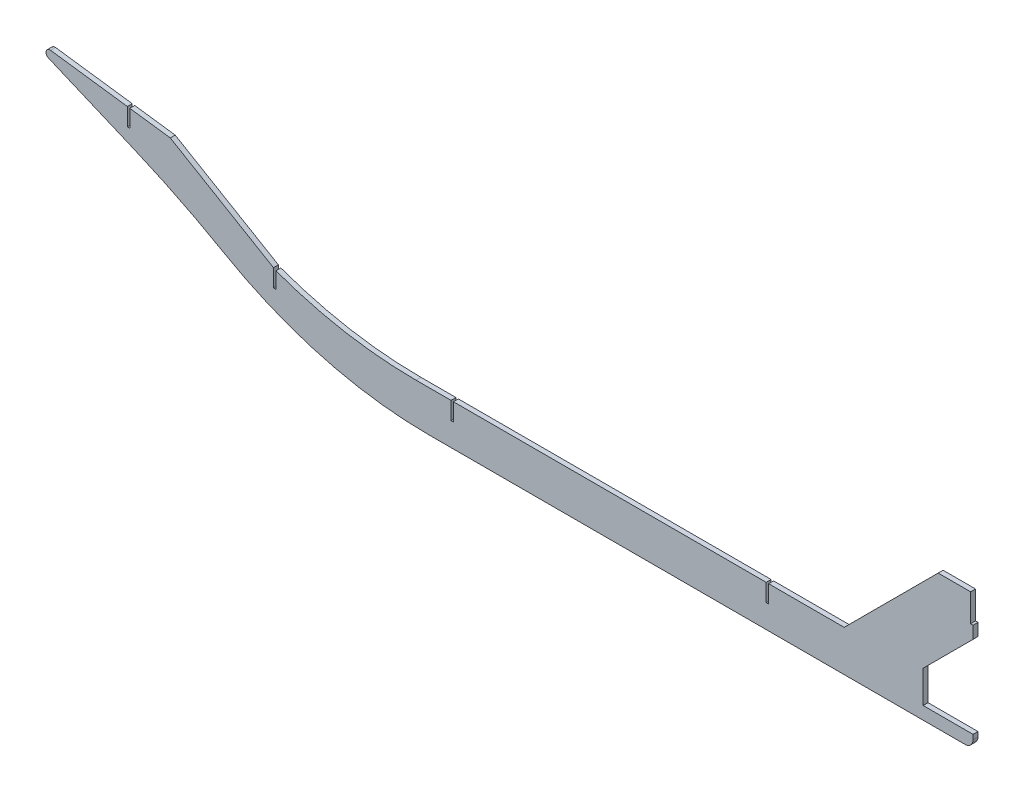
ISO-10303-21;
HEADER;
FILE_DESCRIPTION(('STEP AP214'),'2;1');
FILE_NAME('part.step','',(''),(''),'','','');
FILE_SCHEMA(('AUTOMOTIVE_DESIGN { 1 0 10303 214 1 1 1 1 }'));
ENDSEC;
DATA;
#1=APPLICATION_CONTEXT('core data for automotive mechanical design processes');
#2=APPLICATION_PROTOCOL_DEFINITION('international standard','automotive_design',2000,#1);
#3=PRODUCT_CONTEXT('',#1,'mechanical');
#4=PRODUCT('Part','Part','',(#3));
#5=PRODUCT_RELATED_PRODUCT_CATEGORY('part','',(#4));
#6=PRODUCT_DEFINITION_FORMATION('','',#4);
#7=PRODUCT_DEFINITION_CONTEXT('part definition',#1,'design');
#8=PRODUCT_DEFINITION('design','',#6,#7);
#9=PRODUCT_DEFINITION_SHAPE('','',#8);
#10=(LENGTH_UNIT() NAMED_UNIT(*) SI_UNIT(.MILLI.,.METRE.));
#11=(NAMED_UNIT(*) PLANE_ANGLE_UNIT() SI_UNIT($,.RADIAN.));
#12=(NAMED_UNIT(*) SI_UNIT($,.STERADIAN.) SOLID_ANGLE_UNIT());
#13=UNCERTAINTY_MEASURE_WITH_UNIT(LENGTH_MEASURE(1.E-05),#10,'distance_accuracy_value','');
#14=(GEOMETRIC_REPRESENTATION_CONTEXT(3) GLOBAL_UNCERTAINTY_ASSIGNED_CONTEXT((#13)) GLOBAL_UNIT_ASSIGNED_CONTEXT((#10,
#11,#12)) REPRESENTATION_CONTEXT('',''));
#15=CARTESIAN_POINT('',(0.,0.,0.));
#16=DIRECTION('',(0.,0.,1.));
#17=DIRECTION('',(1.,0.,0.));
#18=AXIS2_PLACEMENT_3D('',#15,#16,#17);
#19=CARTESIAN_POINT('',(0.,15.5486294204919,6.));
#20=DIRECTION('',(-1.,0.,0.));
#21=DIRECTION('',(0.,0.,1.));
#22=AXIS2_PLACEMENT_3D('',#19,#20,#21);
#23=PLANE('',#22);
#24=DIRECTION('',(0.,1.,0.));
#25=VECTOR('',#24,1.);
#26=CARTESIAN_POINT('',(0.,15.5486294204919,6.));
#27=LINE('',#26,#25);
#28=CARTESIAN_POINT('',(0.,10.,6.));
#29=VERTEX_POINT('',#28);
#30=CARTESIAN_POINT('',(0.,15.5486294204919,6.));
#31=VERTEX_POINT('',#30);
#32=EDGE_CURVE('E255',#29,#31,#27,.T.);
#33=ORIENTED_EDGE('',*,*,#32,.F.);
#34=DIRECTION('',(0.,0.,-1.));
#35=VECTOR('',#34,1.);
#36=CARTESIAN_POINT('',(0.,10.,6.));
#37=LINE('',#36,#35);
#38=CARTESIAN_POINT('',(0.,10.,0.));
#39=VERTEX_POINT('',#38);
#40=EDGE_CURVE('E305',#29,#39,#37,.T.);
#41=ORIENTED_EDGE('',*,*,#40,.T.);
#42=DIRECTION('',(0.,1.,0.));
#43=VECTOR('',#42,1.);
#44=CARTESIAN_POINT('',(0.,15.5486294204919,0.));
#45=LINE('',#44,#43);
#46=CARTESIAN_POINT('',(0.,15.5486294204919,0.));
#47=VERTEX_POINT('',#46);
#48=EDGE_CURVE('E280',#39,#47,#45,.T.);
#49=ORIENTED_EDGE('',*,*,#48,.T.);
#50=DIRECTION('',(0.,0.,-1.));
#51=VECTOR('',#50,1.);
#52=CARTESIAN_POINT('',(0.,15.5486294204919,6.));
#53=LINE('',#52,#51);
#54=EDGE_CURVE('E273',#31,#47,#53,.T.);
#55=ORIENTED_EDGE('',*,*,#54,.F.);
#56=EDGE_LOOP('',(#33,#41,#49,#55));
#57=FACE_BOUND('',#56,.T.);
#58=ADVANCED_FACE('F35',(#57),#23,.F.);
#59=CARTESIAN_POINT('',(-60.9679598196648,15.5486294204919,6.));
#60=DIRECTION('',(0.,-1.,0.));
#61=DIRECTION('',(1.,0.,0.));
#62=AXIS2_PLACEMENT_3D('',#59,#60,#61);
#63=PLANE('',#62);
#64=DIRECTION('',(-1.,0.,0.));
#65=VECTOR('',#64,1.);
#66=CARTESIAN_POINT('',(-60.9679598196648,15.5486294204919,0.));
#67=LINE('',#66,#65);
#68=CARTESIAN_POINT('',(-60.9679598196648,15.5486294204919,0.));
#69=VERTEX_POINT('',#68);
#70=EDGE_CURVE('E441',#47,#69,#67,.T.);
#71=ORIENTED_EDGE('',*,*,#70,.T.);
#72=DIRECTION('',(0.,0.,-1.));
#73=VECTOR('',#72,1.);
#74=CARTESIAN_POINT('',(-60.9679598196648,15.5486294204919,6.));
#75=LINE('',#74,#73);
#76=CARTESIAN_POINT('',(-60.9679598196648,15.5486294204919,6.));
#77=VERTEX_POINT('',#76);
#78=EDGE_CURVE('E275',#77,#69,#75,.T.);
#79=ORIENTED_EDGE('',*,*,#78,.F.);
#80=DIRECTION('',(-1.,0.,0.));
#81=VECTOR('',#80,1.);
#82=CARTESIAN_POINT('',(-60.9679598196648,15.5486294204919,6.));
#83=LINE('',#82,#81);
#84=EDGE_CURVE('E259',#31,#77,#83,.T.);
#85=ORIENTED_EDGE('',*,*,#84,.F.);
#86=ORIENTED_EDGE('',*,*,#54,.T.);
#87=EDGE_LOOP('',(#71,#79,#85,#86));
#88=FACE_BOUND('',#87,.T.);
#89=ADVANCED_FACE('F272',(#88),#63,.F.);
#90=CARTESIAN_POINT('',(-60.9679598196648,55.010449705944,6.));
#91=DIRECTION('',(-1.,0.,0.));
#92=DIRECTION('',(0.,-1.,0.));
#93=AXIS2_PLACEMENT_3D('',#90,#91,#92);
#94=PLANE('',#93);
#95=DIRECTION('',(0.,1.,0.));
#96=VECTOR('',#95,1.);
#97=CARTESIAN_POINT('',(-60.9679598196648,55.010449705944,0.));
#98=LINE('',#97,#96);
#99=CARTESIAN_POINT('',(-60.9679598196648,55.010449705944,0.));
#100=VERTEX_POINT('',#99);
#101=EDGE_CURVE('E435',#69,#100,#98,.T.);
#102=ORIENTED_EDGE('',*,*,#101,.T.);
#103=DIRECTION('',(0.,0.,-1.));
#104=VECTOR('',#103,1.);
#105=CARTESIAN_POINT('',(-60.9679598196648,55.010449705944,6.));
#106=LINE('',#105,#104);
#107=CARTESIAN_POINT('',(-60.9679598196648,55.010449705944,6.));
#108=VERTEX_POINT('',#107);
#109=EDGE_CURVE('E287',#108,#100,#106,.T.);
#110=ORIENTED_EDGE('',*,*,#109,.F.);
#111=DIRECTION('',(0.,1.,0.));
#112=VECTOR('',#111,1.);
#113=CARTESIAN_POINT('',(-60.9679598196648,55.010449705944,6.));
#114=LINE('',#113,#112);
#115=EDGE_CURVE('E277',#77,#108,#114,.T.);
#116=ORIENTED_EDGE('',*,*,#115,.F.);
#117=ORIENTED_EDGE('',*,*,#78,.T.);
#118=EDGE_LOOP('',(#102,#110,#116,#117));
#119=FACE_BOUND('',#118,.T.);
#120=ADVANCED_FACE('F500',(#119),#94,.F.);
#121=CARTESIAN_POINT('',(0.,115.978409525609,6.));
#122=DIRECTION('',(-0.707106781186548,0.707106781186547,0.));
#123=DIRECTION('',(-0.707106781186547,-0.707106781186548,0.));
#124=AXIS2_PLACEMENT_3D('',#121,#122,#123);
#125=PLANE('',#124);
#126=DIRECTION('',(0.707106781186547,0.707106781186548,0.));
#127=VECTOR('',#126,1.);
#128=CARTESIAN_POINT('',(0.,115.978409525609,0.));
#129=LINE('',#128,#127);
#130=CARTESIAN_POINT('',(0.,115.978409525609,0.));
#131=VERTEX_POINT('',#130);
#132=EDGE_CURVE('E430',#100,#131,#129,.T.);
#133=ORIENTED_EDGE('',*,*,#132,.T.);
#134=DIRECTION('',(0.,0.,-1.));
#135=VECTOR('',#134,1.);
#136=CARTESIAN_POINT('',(0.,115.978409525609,6.));
#137=LINE('',#136,#135);
#138=CARTESIAN_POINT('',(0.,115.978409525609,6.));
#139=VERTEX_POINT('',#138);
#140=EDGE_CURVE('E421',#139,#131,#137,.T.);
#141=ORIENTED_EDGE('',*,*,#140,.F.);
#142=DIRECTION('',(0.707106781186547,0.707106781186548,0.));
#143=VECTOR('',#142,1.);
#144=CARTESIAN_POINT('',(0.,115.978409525609,6.));
#145=LINE('',#144,#143);
#146=EDGE_CURVE('E431',#108,#139,#145,.T.);
#147=ORIENTED_EDGE('',*,*,#146,.F.);
#148=ORIENTED_EDGE('',*,*,#109,.T.);
#149=EDGE_LOOP('',(#133,#141,#147,#148));
#150=FACE_BOUND('',#149,.T.);
#151=ADVANCED_FACE('F428',(#150),#125,.F.);
#152=CARTESIAN_POINT('',(0.,115.978409525609,6.));
#153=DIRECTION('',(-1.,0.,0.));
#154=DIRECTION('',(0.,0.,1.));
#155=AXIS2_PLACEMENT_3D('',#152,#153,#154);
#156=PLANE('',#155);
#157=DIRECTION('',(0.,1.,0.));
#158=VECTOR('',#157,1.);
#159=CARTESIAN_POINT('',(0.,115.978409525609,0.));
#160=LINE('',#159,#158);
#161=CARTESIAN_POINT('',(0.,130.978409525609,0.));
#162=VERTEX_POINT('',#161);
#163=EDGE_CURVE('E437',#131,#162,#160,.T.);
#164=ORIENTED_EDGE('',*,*,#163,.T.);
#165=DIRECTION('',(0.,0.,-1.));
#166=VECTOR('',#165,1.);
#167=CARTESIAN_POINT('',(0.,130.978409525609,6.));
#168=LINE('',#167,#166);
#169=CARTESIAN_POINT('',(0.,130.978409525609,6.));
#170=VERTEX_POINT('',#169);
#171=EDGE_CURVE('E418',#170,#162,#168,.T.);
#172=ORIENTED_EDGE('',*,*,#171,.F.);
#173=DIRECTION('',(0.,1.,0.));
#174=VECTOR('',#173,1.);
#175=CARTESIAN_POINT('',(0.,115.978409525609,6.));
#176=LINE('',#175,#174);
#177=EDGE_CURVE('E502',#139,#170,#176,.T.);
#178=ORIENTED_EDGE('',*,*,#177,.F.);
#179=ORIENTED_EDGE('',*,*,#140,.T.);
#180=EDGE_LOOP('',(#164,#172,#178,#179));
#181=FACE_BOUND('',#180,.T.);
#182=ADVANCED_FACE('F634',(#181),#156,.F.);
#183=CARTESIAN_POINT('',(0.,130.978409525609,6.));
#184=DIRECTION('',(0.,-1.,0.));
#185=DIRECTION('',(0.,0.,-1.));
#186=AXIS2_PLACEMENT_3D('',#183,#184,#185);
#187=PLANE('',#186);
#188=DIRECTION('',(-1.,0.,0.));
#189=VECTOR('',#188,1.);
#190=CARTESIAN_POINT('',(0.,130.978409525609,0.));
#191=LINE('',#190,#189);
#192=CARTESIAN_POINT('',(-3.00000000000001,130.978409525609,0.));
#193=VERTEX_POINT('',#192);
#194=EDGE_CURVE('E439',#162,#193,#191,.T.);
#195=ORIENTED_EDGE('',*,*,#194,.T.);
#196=DIRECTION('',(0.,0.,-1.));
#197=VECTOR('',#196,1.);
#198=CARTESIAN_POINT('',(-3.00000000000001,130.978409525609,6.));
#199=LINE('',#198,#197);
#200=CARTESIAN_POINT('',(-3.00000000000001,130.978409525609,6.));
#201=VERTEX_POINT('',#200);
#202=EDGE_CURVE('E415',#201,#193,#199,.T.);
#203=ORIENTED_EDGE('',*,*,#202,.F.);
#204=DIRECTION('',(-1.,0.,0.));
#205=VECTOR('',#204,1.);
#206=CARTESIAN_POINT('',(0.,130.978409525609,6.));
#207=LINE('',#206,#205);
#208=EDGE_CURVE('E506',#170,#201,#207,.T.);
#209=ORIENTED_EDGE('',*,*,#208,.F.);
#210=ORIENTED_EDGE('',*,*,#171,.T.);
#211=EDGE_LOOP('',(#195,#203,#209,#210));
#212=FACE_BOUND('',#211,.T.);
#213=ADVANCED_FACE('F630',(#212),#187,.F.);
#214=CARTESIAN_POINT('',(-3.00000000000001,130.978409525609,6.));
#215=DIRECTION('',(-1.,0.,0.));
#216=DIRECTION('',(0.,-1.,0.));
#217=AXIS2_PLACEMENT_3D('',#214,#215,#216);
#218=PLANE('',#217);
#219=DIRECTION('',(0.,1.,0.));
#220=VECTOR('',#219,1.);
#221=CARTESIAN_POINT('',(-3.00000000000001,130.978409525609,0.));
#222=LINE('',#221,#220);
#223=CARTESIAN_POINT('',(-3.00000000000001,164.760181479067,0.));
#224=VERTEX_POINT('',#223);
#225=EDGE_CURVE('E446',#193,#224,#222,.T.);
#226=ORIENTED_EDGE('',*,*,#225,.T.);
#227=DIRECTION('',(0.,0.,-1.));
#228=VECTOR('',#227,1.);
#229=CARTESIAN_POINT('',(-3.00000000000001,164.760181479067,6.));
#230=LINE('',#229,#228);
#231=CARTESIAN_POINT('',(-3.00000000000001,164.760181479067,6.));
#232=VERTEX_POINT('',#231);
#233=EDGE_CURVE('E412',#232,#224,#230,.T.);
#234=ORIENTED_EDGE('',*,*,#233,.F.);
#235=DIRECTION('',(0.,1.,0.));
#236=VECTOR('',#235,1.);
#237=CARTESIAN_POINT('',(-3.00000000000001,130.978409525609,6.));
#238=LINE('',#237,#236);
#239=EDGE_CURVE('E508',#201,#232,#238,.T.);
#240=ORIENTED_EDGE('',*,*,#239,.F.);
#241=ORIENTED_EDGE('',*,*,#202,.T.);
#242=EDGE_LOOP('',(#226,#234,#240,#241));
#243=FACE_BOUND('',#242,.T.);
#244=ADVANCED_FACE('F626',(#243),#218,.F.);
#245=CARTESIAN_POINT('',(-42.6200232158662,164.760181479067,6.));
#246=DIRECTION('',(0.,-1.,0.));
#247=DIRECTION('',(1.,0.,0.));
#248=AXIS2_PLACEMENT_3D('',#245,#246,#247);
#249=PLANE('',#248);
#250=DIRECTION('',(-1.,0.,0.));
#251=VECTOR('',#250,1.);
#252=CARTESIAN_POINT('',(-42.6200232158662,164.760181479067,0.));
#253=LINE('',#252,#251);
#254=CARTESIAN_POINT('',(-42.6200232158662,164.760181479067,0.));
#255=VERTEX_POINT('',#254);
#256=EDGE_CURVE('E448',#224,#255,#253,.T.);
#257=ORIENTED_EDGE('',*,*,#256,.T.);
#258=DIRECTION('',(0.,0.,-1.));
#259=VECTOR('',#258,1.);
#260=CARTESIAN_POINT('',(-42.6200232158662,164.760181479067,6.));
#261=LINE('',#260,#259);
#262=CARTESIAN_POINT('',(-42.6200232158662,164.760181479067,6.));
#263=VERTEX_POINT('',#262);
#264=EDGE_CURVE('E409',#263,#255,#261,.T.);
#265=ORIENTED_EDGE('',*,*,#264,.F.);
#266=DIRECTION('',(-1.,0.,0.));
#267=VECTOR('',#266,1.);
#268=CARTESIAN_POINT('',(-42.6200232158662,164.760181479067,6.));
#269=LINE('',#268,#267);
#270=EDGE_CURVE('E510',#232,#263,#269,.T.);
#271=ORIENTED_EDGE('',*,*,#270,.F.);
#272=ORIENTED_EDGE('',*,*,#233,.T.);
#273=EDGE_LOOP('',(#257,#265,#271,#272));
#274=FACE_BOUND('',#273,.T.);
#275=ADVANCED_FACE('F621',(#274),#249,.F.);
#276=CARTESIAN_POINT('',(-157.380204694933,49.9999999999999,6.));
#277=DIRECTION('',(0.707106781186548,-0.707106781186547,0.));
#278=DIRECTION('',(0.707106781186547,0.707106781186548,0.));
#279=AXIS2_PLACEMENT_3D('',#276,#277,#278);
#280=PLANE('',#279);
#281=DIRECTION('',(-0.707106781186547,-0.707106781186548,0.));
#282=VECTOR('',#281,1.);
#283=CARTESIAN_POINT('',(-157.380204694933,49.9999999999999,0.));
#284=LINE('',#283,#282);
#285=CARTESIAN_POINT('',(-157.380204694933,49.9999999999999,0.));
#286=VERTEX_POINT('',#285);
#287=EDGE_CURVE('E450',#255,#286,#284,.T.);
#288=ORIENTED_EDGE('',*,*,#287,.T.);
#289=DIRECTION('',(0.,0.,-1.));
#290=VECTOR('',#289,1.);
#291=CARTESIAN_POINT('',(-157.380204694933,49.9999999999999,6.));
#292=LINE('',#291,#290);
#293=CARTESIAN_POINT('',(-157.380204694933,49.9999999999999,6.));
#294=VERTEX_POINT('',#293);
#295=EDGE_CURVE('E406',#294,#286,#292,.T.);
#296=ORIENTED_EDGE('',*,*,#295,.F.);
#297=DIRECTION('',(-0.707106781186547,-0.707106781186548,0.));
#298=VECTOR('',#297,1.);
#299=CARTESIAN_POINT('',(-157.380204694933,49.9999999999999,6.));
#300=LINE('',#299,#298);
#301=EDGE_CURVE('E512',#263,#294,#300,.T.);
#302=ORIENTED_EDGE('',*,*,#301,.F.);
#303=ORIENTED_EDGE('',*,*,#264,.T.);
#304=EDGE_LOOP('',(#288,#296,#302,#303));
#305=FACE_BOUND('',#304,.T.);
#306=ADVANCED_FACE('F616',(#305),#280,.F.);
#307=CARTESIAN_POINT('',(-249.546237876082,50.,6.));
#308=DIRECTION('',(0.,-1.,0.));
#309=DIRECTION('',(1.,0.,0.));
#310=AXIS2_PLACEMENT_3D('',#307,#308,#309);
#311=PLANE('',#310);
#312=DIRECTION('',(-1.,0.,0.));
#313=VECTOR('',#312,1.);
#314=CARTESIAN_POINT('',(-249.546237876082,50.,0.));
#315=LINE('',#314,#313);
#316=CARTESIAN_POINT('',(-249.546237876082,50.,0.));
#317=VERTEX_POINT('',#316);
#318=EDGE_CURVE('E452',#286,#317,#315,.T.);
#319=ORIENTED_EDGE('',*,*,#318,.T.);
#320=DIRECTION('',(0.,0.,-1.));
#321=VECTOR('',#320,1.);
#322=CARTESIAN_POINT('',(-249.546237876082,50.,6.));
#323=LINE('',#322,#321);
#324=CARTESIAN_POINT('',(-249.546237876082,50.,6.));
#325=VERTEX_POINT('',#324);
#326=EDGE_CURVE('E403',#325,#317,#323,.T.);
#327=ORIENTED_EDGE('',*,*,#326,.F.);
#328=DIRECTION('',(-1.,0.,0.));
#329=VECTOR('',#328,1.);
#330=CARTESIAN_POINT('',(-249.546237876082,50.,6.));
#331=LINE('',#330,#329);
#332=EDGE_CURVE('E514',#294,#325,#331,.T.);
#333=ORIENTED_EDGE('',*,*,#332,.F.);
#334=ORIENTED_EDGE('',*,*,#295,.T.);
#335=EDGE_LOOP('',(#319,#327,#333,#334));
#336=FACE_BOUND('',#335,.T.);
#337=ADVANCED_FACE('F612',(#336),#311,.F.);
#338=CARTESIAN_POINT('',(-249.546237876082,28.5,6.));
#339=DIRECTION('',(1.,0.,0.));
#340=DIRECTION('',(0.,0.,-1.));
#341=AXIS2_PLACEMENT_3D('',#338,#339,#340);
#342=PLANE('',#341);
#343=DIRECTION('',(0.,-1.,0.));
#344=VECTOR('',#343,1.);
#345=CARTESIAN_POINT('',(-249.546237876082,28.5,0.));
#346=LINE('',#345,#344);
#347=CARTESIAN_POINT('',(-249.546237876082,28.5,0.));
#348=VERTEX_POINT('',#347);
#349=EDGE_CURVE('E454',#317,#348,#346,.T.);
#350=ORIENTED_EDGE('',*,*,#349,.T.);
#351=DIRECTION('',(0.,0.,-1.));
#352=VECTOR('',#351,1.);
#353=CARTESIAN_POINT('',(-249.546237876082,28.5,6.));
#354=LINE('',#353,#352);
#355=CARTESIAN_POINT('',(-249.546237876082,28.5,6.));
#356=VERTEX_POINT('',#355);
#357=EDGE_CURVE('E400',#356,#348,#354,.T.);
#358=ORIENTED_EDGE('',*,*,#357,.F.);
#359=DIRECTION('',(0.,-1.,0.));
#360=VECTOR('',#359,1.);
#361=CARTESIAN_POINT('',(-249.546237876082,28.5,6.));
#362=LINE('',#361,#360);
#363=EDGE_CURVE('E516',#325,#356,#362,.T.);
#364=ORIENTED_EDGE('',*,*,#363,.F.);
#365=ORIENTED_EDGE('',*,*,#326,.T.);
#366=EDGE_LOOP('',(#350,#358,#364,#365));
#367=FACE_BOUND('',#366,.T.);
#368=ADVANCED_FACE('F607',(#367),#342,.F.);
#369=CARTESIAN_POINT('',(-252.546237876082,28.5,6.));
#370=DIRECTION('',(0.,-1.,0.));
#371=DIRECTION('',(0.,0.,-1.));
#372=AXIS2_PLACEMENT_3D('',#369,#370,#371);
#373=PLANE('',#372);
#374=DIRECTION('',(-1.,0.,0.));
#375=VECTOR('',#374,1.);
#376=CARTESIAN_POINT('',(-252.546237876082,28.5,0.));
#377=LINE('',#376,#375);
#378=CARTESIAN_POINT('',(-252.546237876082,28.5,0.));
#379=VERTEX_POINT('',#378);
#380=EDGE_CURVE('E456',#348,#379,#377,.T.);
#381=ORIENTED_EDGE('',*,*,#380,.T.);
#382=DIRECTION('',(0.,0.,-1.));
#383=VECTOR('',#382,1.);
#384=CARTESIAN_POINT('',(-252.546237876082,28.5,6.));
#385=LINE('',#384,#383);
#386=CARTESIAN_POINT('',(-252.546237876082,28.5,6.));
#387=VERTEX_POINT('',#386);
#388=EDGE_CURVE('E397',#387,#379,#385,.T.);
#389=ORIENTED_EDGE('',*,*,#388,.F.);
#390=DIRECTION('',(-1.,0.,0.));
#391=VECTOR('',#390,1.);
#392=CARTESIAN_POINT('',(-252.546237876082,28.5,6.));
#393=LINE('',#392,#391);
#394=EDGE_CURVE('E518',#356,#387,#393,.T.);
#395=ORIENTED_EDGE('',*,*,#394,.F.);
#396=ORIENTED_EDGE('',*,*,#357,.T.);
#397=EDGE_LOOP('',(#381,#389,#395,#396));
#398=FACE_BOUND('',#397,.T.);
#399=ADVANCED_FACE('F601',(#398),#373,.F.);
#400=CARTESIAN_POINT('',(-252.546237876082,50.,6.));
#401=DIRECTION('',(-1.,0.,0.));
#402=DIRECTION('',(0.,0.,1.));
#403=AXIS2_PLACEMENT_3D('',#400,#401,#402);
#404=PLANE('',#403);
#405=DIRECTION('',(0.,1.,0.));
#406=VECTOR('',#405,1.);
#407=CARTESIAN_POINT('',(-252.546237876082,50.,0.));
#408=LINE('',#407,#406);
#409=CARTESIAN_POINT('',(-252.546237876082,50.,0.));
#410=VERTEX_POINT('',#409);
#411=EDGE_CURVE('E458',#379,#410,#408,.T.);
#412=ORIENTED_EDGE('',*,*,#411,.T.);
#413=DIRECTION('',(0.,0.,-1.));
#414=VECTOR('',#413,1.);
#415=CARTESIAN_POINT('',(-252.546237876082,50.,6.));
#416=LINE('',#415,#414);
#417=CARTESIAN_POINT('',(-252.546237876082,50.,6.));
#418=VERTEX_POINT('',#417);
#419=EDGE_CURVE('E394',#418,#410,#416,.T.);
#420=ORIENTED_EDGE('',*,*,#419,.F.);
#421=DIRECTION('',(0.,1.,0.));
#422=VECTOR('',#421,1.);
#423=CARTESIAN_POINT('',(-252.546237876082,50.,6.));
#424=LINE('',#423,#422);
#425=EDGE_CURVE('E520',#387,#418,#424,.T.);
#426=ORIENTED_EDGE('',*,*,#425,.F.);
#427=ORIENTED_EDGE('',*,*,#388,.T.);
#428=EDGE_LOOP('',(#412,#420,#426,#427));
#429=FACE_BOUND('',#428,.T.);
#430=ADVANCED_FACE('F597',(#429),#404,.F.);
#431=CARTESIAN_POINT('',(-634.333486787897,50.,6.));
#432=DIRECTION('',(0.,-1.,0.));
#433=DIRECTION('',(1.,0.,0.));
#434=AXIS2_PLACEMENT_3D('',#431,#432,#433);
#435=PLANE('',#434);
#436=DIRECTION('',(-1.,0.,0.));
#437=VECTOR('',#436,1.);
#438=CARTESIAN_POINT('',(-634.333486787897,50.,0.));
#439=LINE('',#438,#437);
#440=CARTESIAN_POINT('',(-634.333486787897,50.,0.));
#441=VERTEX_POINT('',#440);
#442=EDGE_CURVE('E460',#410,#441,#439,.T.);
#443=ORIENTED_EDGE('',*,*,#442,.T.);
#444=DIRECTION('',(0.,0.,-1.));
#445=VECTOR('',#444,1.);
#446=CARTESIAN_POINT('',(-634.333486787897,50.,6.));
#447=LINE('',#446,#445);
#448=CARTESIAN_POINT('',(-634.333486787897,50.,6.));
#449=VERTEX_POINT('',#448);
#450=EDGE_CURVE('E391',#449,#441,#447,.T.);
#451=ORIENTED_EDGE('',*,*,#450,.F.);
#452=DIRECTION('',(-1.,0.,0.));
#453=VECTOR('',#452,1.);
#454=CARTESIAN_POINT('',(-634.333486787897,50.,6.));
#455=LINE('',#454,#453);
#456=EDGE_CURVE('E522',#418,#449,#455,.T.);
#457=ORIENTED_EDGE('',*,*,#456,.F.);
#458=ORIENTED_EDGE('',*,*,#419,.T.);
#459=EDGE_LOOP('',(#443,#451,#457,#458));
#460=FACE_BOUND('',#459,.T.);
#461=ADVANCED_FACE('F592',(#460),#435,.F.);
#462=CARTESIAN_POINT('',(-634.333486787897,28.5,6.));
#463=DIRECTION('',(1.,0.,0.));
#464=DIRECTION('',(0.,0.,-1.));
#465=AXIS2_PLACEMENT_3D('',#462,#463,#464);
#466=PLANE('',#465);
#467=DIRECTION('',(0.,-1.,0.));
#468=VECTOR('',#467,1.);
#469=CARTESIAN_POINT('',(-634.333486787897,28.5,0.));
#470=LINE('',#469,#468);
#471=CARTESIAN_POINT('',(-634.333486787897,28.5,0.));
#472=VERTEX_POINT('',#471);
#473=EDGE_CURVE('E462',#441,#472,#470,.T.);
#474=ORIENTED_EDGE('',*,*,#473,.T.);
#475=DIRECTION('',(0.,0.,-1.));
#476=VECTOR('',#475,1.);
#477=CARTESIAN_POINT('',(-634.333486787897,28.5,6.));
#478=LINE('',#477,#476);
#479=CARTESIAN_POINT('',(-634.333486787897,28.5,6.));
#480=VERTEX_POINT('',#479);
#481=EDGE_CURVE('E388',#480,#472,#478,.T.);
#482=ORIENTED_EDGE('',*,*,#481,.F.);
#483=DIRECTION('',(0.,-1.,0.));
#484=VECTOR('',#483,1.);
#485=CARTESIAN_POINT('',(-634.333486787897,28.5,6.));
#486=LINE('',#485,#484);
#487=EDGE_CURVE('E524',#449,#480,#486,.T.);
#488=ORIENTED_EDGE('',*,*,#487,.F.);
#489=ORIENTED_EDGE('',*,*,#450,.T.);
#490=EDGE_LOOP('',(#474,#482,#488,#489));
#491=FACE_BOUND('',#490,.T.);
#492=ADVANCED_FACE('F586',(#491),#466,.F.);
#493=CARTESIAN_POINT('',(-637.333486787897,28.5,6.));
#494=DIRECTION('',(0.,-1.,0.));
#495=DIRECTION('',(0.,0.,-1.));
#496=AXIS2_PLACEMENT_3D('',#493,#494,#495);
#497=PLANE('',#496);
#498=DIRECTION('',(-1.,0.,0.));
#499=VECTOR('',#498,1.);
#500=CARTESIAN_POINT('',(-637.333486787897,28.5,0.));
#501=LINE('',#500,#499);
#502=CARTESIAN_POINT('',(-637.333486787897,28.5,0.));
#503=VERTEX_POINT('',#502);
#504=EDGE_CURVE('E464',#472,#503,#501,.T.);
#505=ORIENTED_EDGE('',*,*,#504,.T.);
#506=DIRECTION('',(0.,0.,-1.));
#507=VECTOR('',#506,1.);
#508=CARTESIAN_POINT('',(-637.333486787897,28.5,6.));
#509=LINE('',#508,#507);
#510=CARTESIAN_POINT('',(-637.333486787897,28.5,6.));
#511=VERTEX_POINT('',#510);
#512=EDGE_CURVE('E385',#511,#503,#509,.T.);
#513=ORIENTED_EDGE('',*,*,#512,.F.);
#514=DIRECTION('',(-1.,0.,0.));
#515=VECTOR('',#514,1.);
#516=CARTESIAN_POINT('',(-637.333486787897,28.5,6.));
#517=LINE('',#516,#515);
#518=EDGE_CURVE('E526',#480,#511,#517,.T.);
#519=ORIENTED_EDGE('',*,*,#518,.F.);
#520=ORIENTED_EDGE('',*,*,#481,.T.);
#521=EDGE_LOOP('',(#505,#513,#519,#520));
#522=FACE_BOUND('',#521,.T.);
#523=ADVANCED_FACE('F582',(#522),#497,.F.);
#524=CARTESIAN_POINT('',(-637.333486787897,50.,6.));
#525=DIRECTION('',(-1.,0.,0.));
#526=DIRECTION('',(0.,0.,1.));
#527=AXIS2_PLACEMENT_3D('',#524,#525,#526);
#528=PLANE('',#527);
#529=DIRECTION('',(0.,1.,0.));
#530=VECTOR('',#529,1.);
#531=CARTESIAN_POINT('',(-637.333486787897,50.,0.));
#532=LINE('',#531,#530);
#533=CARTESIAN_POINT('',(-637.333486787897,50.,0.));
#534=VERTEX_POINT('',#533);
#535=EDGE_CURVE('E466',#503,#534,#532,.T.);
#536=ORIENTED_EDGE('',*,*,#535,.T.);
#537=DIRECTION('',(0.,0.,-1.));
#538=VECTOR('',#537,1.);
#539=CARTESIAN_POINT('',(-637.333486787897,50.,6.));
#540=LINE('',#539,#538);
#541=CARTESIAN_POINT('',(-637.333486787897,50.,6.));
#542=VERTEX_POINT('',#541);
#543=EDGE_CURVE('E382',#542,#534,#540,.T.);
#544=ORIENTED_EDGE('',*,*,#543,.F.);
#545=DIRECTION('',(0.,1.,0.));
#546=VECTOR('',#545,1.);
#547=CARTESIAN_POINT('',(-637.333486787897,50.,6.));
#548=LINE('',#547,#546);
#549=EDGE_CURVE('E528',#511,#542,#548,.T.);
#550=ORIENTED_EDGE('',*,*,#549,.F.);
#551=ORIENTED_EDGE('',*,*,#512,.T.);
#552=EDGE_LOOP('',(#536,#544,#550,#551));
#553=FACE_BOUND('',#552,.T.);
#554=ADVANCED_FACE('F578',(#553),#528,.F.);
#555=CARTESIAN_POINT('',(-799.897120856632,49.9999999999999,6.));
#556=DIRECTION('',(0.,-1.,0.));
#557=DIRECTION('',(1.,0.,0.));
#558=AXIS2_PLACEMENT_3D('',#555,#556,#557);
#559=PLANE('',#558);
#560=DIRECTION('',(-1.,0.,0.));
#561=VECTOR('',#560,1.);
#562=CARTESIAN_POINT('',(-799.897120856632,49.9999999999999,0.));
#563=LINE('',#562,#561);
#564=CARTESIAN_POINT('',(-680.124643354107,49.9999999999999,0.));
#565=VERTEX_POINT('',#564);
#566=EDGE_CURVE('E468',#534,#565,#563,.T.);
#567=ORIENTED_EDGE('',*,*,#566,.T.);
#568=DIRECTION('',(0.,0.,1.));
#569=VECTOR('',#568,1.);
#570=CARTESIAN_POINT('',(-680.124643354107,49.9999999999999,6.));
#571=LINE('',#570,#569);
#572=CARTESIAN_POINT('',(-680.124643354107,49.9999999999999,6.));
#573=VERTEX_POINT('',#572);
#574=EDGE_CURVE('E50',#565,#573,#571,.T.);
#575=ORIENTED_EDGE('',*,*,#574,.T.);
#576=DIRECTION('',(-1.,0.,0.));
#577=VECTOR('',#576,1.);
#578=CARTESIAN_POINT('',(-799.897120856632,49.9999999999999,6.));
#579=LINE('',#578,#577);
#580=EDGE_CURVE('E530',#542,#573,#579,.T.);
#581=ORIENTED_EDGE('',*,*,#580,.F.);
#582=ORIENTED_EDGE('',*,*,#543,.T.);
#583=EDGE_LOOP('',(#567,#575,#581,#582));
#584=FACE_BOUND('',#583,.T.);
#585=ADVANCED_FACE('F573',(#584),#559,.F.);
#586=CARTESIAN_POINT('',(-851.092873153304,60.4045345810529,6.));
#587=DIRECTION('',(1.,0.,0.));
#588=DIRECTION('',(0.,0.,-1.));
#589=AXIS2_PLACEMENT_3D('',#586,#587,#588);
#590=PLANE('',#589);
#591=DIRECTION('',(0.,-1.,0.));
#592=VECTOR('',#591,1.);
#593=CARTESIAN_POINT('',(-851.092873153304,60.4045345810529,0.));
#594=LINE('',#593,#592);
#595=CARTESIAN_POINT('',(-851.092873153304,80.1384625239807,0.));
#596=VERTEX_POINT('',#595);
#597=CARTESIAN_POINT('',(-851.092873153304,60.4045345810529,0.));
#598=VERTEX_POINT('',#597);
#599=EDGE_CURVE('E470',#596,#598,#594,.T.);
#600=ORIENTED_EDGE('',*,*,#599,.T.);
#601=DIRECTION('',(0.,0.,-1.));
#602=VECTOR('',#601,1.);
#603=CARTESIAN_POINT('',(-851.092873153304,60.4045345810529,6.));
#604=LINE('',#603,#602);
#605=CARTESIAN_POINT('',(-851.092873153304,60.4045345810529,6.));
#606=VERTEX_POINT('',#605);
#607=EDGE_CURVE('E376',#606,#598,#604,.T.);
#608=ORIENTED_EDGE('',*,*,#607,.F.);
#609=DIRECTION('',(0.,-1.,0.));
#610=VECTOR('',#609,1.);
#611=CARTESIAN_POINT('',(-851.092873153304,60.4045345810529,6.));
#612=LINE('',#611,#610);
#613=CARTESIAN_POINT('',(-851.092873153304,80.1384625239807,6.));
#614=VERTEX_POINT('',#613);
#615=EDGE_CURVE('E532',#614,#606,#612,.T.);
#616=ORIENTED_EDGE('',*,*,#615,.F.);
#617=DIRECTION('',(0.,0.,-1.));
#618=VECTOR('',#617,1.);
#619=CARTESIAN_POINT('',(-851.092873153304,80.1384625239807,6.));
#620=LINE('',#619,#618);
#621=EDGE_CURVE('E379',#614,#596,#620,.T.);
#622=ORIENTED_EDGE('',*,*,#621,.T.);
#623=EDGE_LOOP('',(#600,#608,#616,#622));
#624=FACE_BOUND('',#623,.T.);
#625=ADVANCED_FACE('F567',(#624),#590,.F.);
#626=CARTESIAN_POINT('',(-854.092873153304,60.4045345810529,6.));
#627=DIRECTION('',(0.,-1.,0.));
#628=DIRECTION('',(1.,0.,0.));
#629=AXIS2_PLACEMENT_3D('',#626,#627,#628);
#630=PLANE('',#629);
#631=DIRECTION('',(-1.,0.,0.));
#632=VECTOR('',#631,1.);
#633=CARTESIAN_POINT('',(-854.092873153304,60.4045345810529,0.));
#634=LINE('',#633,#632);
#635=CARTESIAN_POINT('',(-854.092873153304,60.4045345810529,0.));
#636=VERTEX_POINT('',#635);
#637=EDGE_CURVE('E472',#598,#636,#634,.T.);
#638=ORIENTED_EDGE('',*,*,#637,.T.);
#639=DIRECTION('',(0.,0.,-1.));
#640=VECTOR('',#639,1.);
#641=CARTESIAN_POINT('',(-854.092873153304,60.4045345810529,6.));
#642=LINE('',#641,#640);
#643=CARTESIAN_POINT('',(-854.092873153304,60.4045345810529,6.));
#644=VERTEX_POINT('',#643);
#645=EDGE_CURVE('E373',#644,#636,#642,.T.);
#646=ORIENTED_EDGE('',*,*,#645,.F.);
#647=DIRECTION('',(-1.,0.,0.));
#648=VECTOR('',#647,1.);
#649=CARTESIAN_POINT('',(-854.092873153304,60.4045345810529,6.));
#650=LINE('',#649,#648);
#651=EDGE_CURVE('E534',#606,#644,#650,.T.);
#652=ORIENTED_EDGE('',*,*,#651,.F.);
#653=ORIENTED_EDGE('',*,*,#607,.T.);
#654=EDGE_LOOP('',(#638,#646,#652,#653));
#655=FACE_BOUND('',#654,.T.);
#656=ADVANCED_FACE('F562',(#655),#630,.F.);
#657=CARTESIAN_POINT('',(-854.092873153304,81.9045345810529,6.));
#658=DIRECTION('',(-1.,0.,0.));
#659=DIRECTION('',(0.,0.,1.));
#660=AXIS2_PLACEMENT_3D('',#657,#658,#659);
#661=PLANE('',#660);
#662=DIRECTION('',(0.,1.,0.));
#663=VECTOR('',#662,1.);
#664=CARTESIAN_POINT('',(-854.092873153304,81.9045345810529,0.));
#665=LINE('',#664,#663);
#666=CARTESIAN_POINT('',(-854.092873153304,81.9045345810529,0.));
#667=VERTEX_POINT('',#666);
#668=EDGE_CURVE('E474',#636,#667,#665,.T.);
#669=ORIENTED_EDGE('',*,*,#668,.T.);
#670=DIRECTION('',(0.,0.,-1.));
#671=VECTOR('',#670,1.);
#672=CARTESIAN_POINT('',(-854.092873153304,81.9045345810529,6.));
#673=LINE('',#672,#671);
#674=CARTESIAN_POINT('',(-854.092873153304,81.9045345810529,6.));
#675=VERTEX_POINT('',#674);
#676=EDGE_CURVE('E370',#675,#667,#673,.T.);
#677=ORIENTED_EDGE('',*,*,#676,.F.);
#678=DIRECTION('',(0.,1.,0.));
#679=VECTOR('',#678,1.);
#680=CARTESIAN_POINT('',(-854.092873153304,81.9045345810529,6.));
#681=LINE('',#680,#679);
#682=EDGE_CURVE('E536',#644,#675,#681,.T.);
#683=ORIENTED_EDGE('',*,*,#682,.F.);
#684=ORIENTED_EDGE('',*,*,#645,.T.);
#685=EDGE_LOOP('',(#669,#677,#683,#684));
#686=FACE_BOUND('',#685,.T.);
#687=ADVANCED_FACE('F558',(#686),#661,.F.);
#688=CARTESIAN_POINT('',(-980.086684510101,156.075917781474,6.));
#689=DIRECTION('',(-0.50731165283338,-0.861762662743904,0.));
#690=DIRECTION('',(0.861762662743904,-0.50731165283338,0.));
#691=AXIS2_PLACEMENT_3D('',#688,#689,#690);
#692=PLANE('',#691);
#693=DIRECTION('',(-0.861762662743904,0.50731165283338,0.));
#694=VECTOR('',#693,1.);
#695=CARTESIAN_POINT('',(-980.086684510101,156.075917781474,0.));
#696=LINE('',#695,#694);
#697=CARTESIAN_POINT('',(-980.086684510101,156.075917781474,0.));
#698=VERTEX_POINT('',#697);
#699=EDGE_CURVE('E476',#667,#698,#696,.T.);
#700=ORIENTED_EDGE('',*,*,#699,.T.);
#701=DIRECTION('',(0.,0.,-1.));
#702=VECTOR('',#701,1.);
#703=CARTESIAN_POINT('',(-980.086684510101,156.075917781474,6.));
#704=LINE('',#703,#702);
#705=CARTESIAN_POINT('',(-980.086684510101,156.075917781474,6.));
#706=VERTEX_POINT('',#705);
#707=EDGE_CURVE('E367',#706,#698,#704,.T.);
#708=ORIENTED_EDGE('',*,*,#707,.F.);
#709=DIRECTION('',(-0.861762662743904,0.50731165283338,0.));
#710=VECTOR('',#709,1.);
#711=CARTESIAN_POINT('',(-980.086684510101,156.075917781474,6.));
#712=LINE('',#711,#710);
#713=EDGE_CURVE('E538',#675,#706,#712,.T.);
#714=ORIENTED_EDGE('',*,*,#713,.F.);
#715=ORIENTED_EDGE('',*,*,#676,.T.);
#716=EDGE_LOOP('',(#700,#708,#714,#715));
#717=FACE_BOUND('',#716,.T.);
#718=ADVANCED_FACE('F554',(#717),#692,.F.);
#719=CARTESIAN_POINT('',(-1029.50896649871,162.707860864103,6.));
#720=DIRECTION('',(-0.132997250076028,-0.99111640662044,0.));
#721=DIRECTION('',(0.991116406620441,-0.132997250076028,0.));
#722=AXIS2_PLACEMENT_3D('',#719,#720,#721);
#723=PLANE('',#722);
#724=DIRECTION('',(-0.991116406620441,0.132997250076028,0.));
#725=VECTOR('',#724,1.);
#726=CARTESIAN_POINT('',(-1029.50896649871,162.707860864103,0.));
#727=LINE('',#726,#725);
#728=CARTESIAN_POINT('',(-1029.50896649871,162.707860864103,0.));
#729=VERTEX_POINT('',#728);
#730=EDGE_CURVE('E478',#698,#729,#727,.T.);
#731=ORIENTED_EDGE('',*,*,#730,.T.);
#732=DIRECTION('',(0.,0.,-1.));
#733=VECTOR('',#732,1.);
#734=CARTESIAN_POINT('',(-1029.50896649871,162.707860864103,6.));
#735=LINE('',#734,#733);
#736=CARTESIAN_POINT('',(-1029.50896649871,162.707860864103,6.));
#737=VERTEX_POINT('',#736);
#738=EDGE_CURVE('E364',#737,#729,#735,.T.);
#739=ORIENTED_EDGE('',*,*,#738,.F.);
#740=DIRECTION('',(-0.991116406620441,0.132997250076028,0.));
#741=VECTOR('',#740,1.);
#742=CARTESIAN_POINT('',(-1029.50896649871,162.707860864103,6.));
#743=LINE('',#742,#741);
#744=EDGE_CURVE('E540',#706,#737,#743,.T.);
#745=ORIENTED_EDGE('',*,*,#744,.F.);
#746=ORIENTED_EDGE('',*,*,#707,.T.);
#747=EDGE_LOOP('',(#731,#739,#745,#746));
#748=FACE_BOUND('',#747,.T.);
#749=ADVANCED_FACE('F550',(#748),#723,.F.);
#750=CARTESIAN_POINT('',(-1029.50896649871,141.610428864756,6.));
#751=DIRECTION('',(1.,0.,0.));
#752=DIRECTION('',(0.,0.,-1.));
#753=AXIS2_PLACEMENT_3D('',#750,#751,#752);
#754=PLANE('',#753);
#755=DIRECTION('',(0.,-1.,0.));
#756=VECTOR('',#755,1.);
#757=CARTESIAN_POINT('',(-1029.50896649871,141.610428864756,0.));
#758=LINE('',#757,#756);
#759=CARTESIAN_POINT('',(-1029.50896649871,141.610428864756,0.));
#760=VERTEX_POINT('',#759);
#761=EDGE_CURVE('E480',#729,#760,#758,.T.);
#762=ORIENTED_EDGE('',*,*,#761,.T.);
#763=DIRECTION('',(0.,0.,-1.));
#764=VECTOR('',#763,1.);
#765=CARTESIAN_POINT('',(-1029.50896649871,141.610428864756,6.));
#766=LINE('',#765,#764);
#767=CARTESIAN_POINT('',(-1029.50896649871,141.610428864756,6.));
#768=VERTEX_POINT('',#767);
#769=EDGE_CURVE('E361',#768,#760,#766,.T.);
#770=ORIENTED_EDGE('',*,*,#769,.F.);
#771=DIRECTION('',(0.,-1.,0.));
#772=VECTOR('',#771,1.);
#773=CARTESIAN_POINT('',(-1029.50896649871,141.610428864756,6.));
#774=LINE('',#773,#772);
#775=EDGE_CURVE('E495',#737,#768,#774,.T.);
#776=ORIENTED_EDGE('',*,*,#775,.F.);
#777=ORIENTED_EDGE('',*,*,#738,.T.);
#778=EDGE_LOOP('',(#762,#770,#776,#777));
#779=FACE_BOUND('',#778,.T.);
#780=ADVANCED_FACE('F545',(#779),#754,.F.);
#781=CARTESIAN_POINT('',(-1032.50896649871,141.610428864756,6.));
#782=DIRECTION('',(0.,-1.,0.));
#783=DIRECTION('',(0.,0.,-1.));
#784=AXIS2_PLACEMENT_3D('',#781,#782,#783);
#785=PLANE('',#784);
#786=DIRECTION('',(-1.,0.,0.));
#787=VECTOR('',#786,1.);
#788=CARTESIAN_POINT('',(-1032.50896649871,141.610428864756,0.));
#789=LINE('',#788,#787);
#790=CARTESIAN_POINT('',(-1032.50896649871,141.610428864756,0.));
#791=VERTEX_POINT('',#790);
#792=EDGE_CURVE('E351',#760,#791,#789,.T.);
#793=ORIENTED_EDGE('',*,*,#792,.T.);
#794=DIRECTION('',(0.,0.,-1.));
#795=VECTOR('',#794,1.);
#796=CARTESIAN_POINT('',(-1032.50896649871,141.610428864756,6.));
#797=LINE('',#796,#795);
#798=CARTESIAN_POINT('',(-1032.50896649871,141.610428864756,6.));
#799=VERTEX_POINT('',#798);
#800=EDGE_CURVE('E358',#799,#791,#797,.T.);
#801=ORIENTED_EDGE('',*,*,#800,.F.);
#802=DIRECTION('',(-1.,0.,0.));
#803=VECTOR('',#802,1.);
#804=CARTESIAN_POINT('',(-1032.50896649871,141.610428864756,6.));
#805=LINE('',#804,#803);
#806=EDGE_CURVE('E492',#768,#799,#805,.T.);
#807=ORIENTED_EDGE('',*,*,#806,.F.);
#808=ORIENTED_EDGE('',*,*,#769,.T.);
#809=EDGE_LOOP('',(#793,#801,#807,#808));
#810=FACE_BOUND('',#809,.T.);
#811=ADVANCED_FACE('F484',(#810),#785,.F.);
#812=CARTESIAN_POINT('',(-1032.50896649871,163.110428864756,6.));
#813=DIRECTION('',(-1.,0.,0.));
#814=DIRECTION('',(0.,0.,1.));
#815=AXIS2_PLACEMENT_3D('',#812,#813,#814);
#816=PLANE('',#815);
#817=DIRECTION('',(0.,1.,0.));
#818=VECTOR('',#817,1.);
#819=CARTESIAN_POINT('',(-1032.50896649871,163.110428864756,0.));
#820=LINE('',#819,#818);
#821=CARTESIAN_POINT('',(-1032.50896649871,163.110428864756,0.));
#822=VERTEX_POINT('',#821);
#823=EDGE_CURVE('E348',#791,#822,#820,.T.);
#824=ORIENTED_EDGE('',*,*,#823,.T.);
#825=DIRECTION('',(0.,0.,-1.));
#826=VECTOR('',#825,1.);
#827=CARTESIAN_POINT('',(-1032.50896649871,163.110428864756,6.));
#828=LINE('',#827,#826);
#829=CARTESIAN_POINT('',(-1032.50896649871,163.110428864756,6.));
#830=VERTEX_POINT('',#829);
#831=EDGE_CURVE('E347',#830,#822,#828,.T.);
#832=ORIENTED_EDGE('',*,*,#831,.F.);
#833=DIRECTION('',(0.,1.,0.));
#834=VECTOR('',#833,1.);
#835=CARTESIAN_POINT('',(-1032.50896649871,163.110428864756,6.));
#836=LINE('',#835,#834);
#837=EDGE_CURVE('E491',#799,#830,#836,.T.);
#838=ORIENTED_EDGE('',*,*,#837,.F.);
#839=ORIENTED_EDGE('',*,*,#800,.T.);
#840=EDGE_LOOP('',(#824,#832,#838,#839));
#841=FACE_BOUND('',#840,.T.);
#842=ADVANCED_FACE('F490',(#841),#816,.F.);
#843=CARTESIAN_POINT('',(-1163.11747193589,180.636697165487,6.));
#844=DIRECTION('',(-0.132997250076028,-0.99111640662044,0.));
#845=DIRECTION('',(0.991116406620441,-0.132997250076028,0.));
#846=AXIS2_PLACEMENT_3D('',#843,#844,#845);
#847=PLANE('',#846);
#848=DIRECTION('',(-0.991116406620441,0.132997250076028,0.));
#849=VECTOR('',#848,1.);
#850=CARTESIAN_POINT('',(-1163.11747193589,180.636697165487,0.));
#851=LINE('',#850,#849);
#852=CARTESIAN_POINT('',(-1126.10714737467,175.670306378104,0.));
#853=VERTEX_POINT('',#852);
#854=EDGE_CURVE('E341',#822,#853,#851,.T.);
#855=ORIENTED_EDGE('',*,*,#854,.T.);
#856=DIRECTION('',(0.,0.,-1.));
#857=VECTOR('',#856,1.);
#858=CARTESIAN_POINT('',(-1126.10714737467,175.670306378104,6.));
#859=LINE('',#858,#857);
#860=CARTESIAN_POINT('',(-1126.10714737467,175.670306378104,6.));
#861=VERTEX_POINT('',#860);
#862=EDGE_CURVE('E317',#853,#861,#859,.F.);
#863=ORIENTED_EDGE('',*,*,#862,.T.);
#864=DIRECTION('',(-0.991116406620441,0.132997250076028,0.));
#865=VECTOR('',#864,1.);
#866=CARTESIAN_POINT('',(-1163.11747193589,180.636697165487,6.));
#867=LINE('',#866,#865);
#868=EDGE_CURVE('E325',#830,#861,#867,.T.);
#869=ORIENTED_EDGE('',*,*,#868,.F.);
#870=ORIENTED_EDGE('',*,*,#831,.T.);
#871=EDGE_LOOP('',(#855,#863,#869,#870));
#872=FACE_BOUND('',#871,.T.);
#873=ADVANCED_FACE('F345',(#872),#847,.F.);
#874=CARTESIAN_POINT('',(-963.993473565416,96.5414304020298,6.));
#875=DIRECTION('',(0.389053271007573,0.921215258405063,0.));
#876=DIRECTION('',(-0.921215258405064,0.389053271007573,0.));
#877=AXIS2_PLACEMENT_3D('',#874,#875,#876);
#878=PLANE('',#877);
#879=DIRECTION('',(0.921215258405064,-0.389053271007573,0.));
#880=VECTOR('',#879,1.);
#881=CARTESIAN_POINT('',(-963.993473565416,96.5414304020298,6.));
#882=LINE('',#881,#880);
#883=CARTESIAN_POINT('',(-1128.71739998009,166.108648052976,6.));
#884=VERTEX_POINT('',#883);
#885=CARTESIAN_POINT('',(-1025.09430071533,122.345906008629,6.));
#886=VERTEX_POINT('',#885);
#887=EDGE_CURVE('E323',#884,#886,#882,.T.);
#888=ORIENTED_EDGE('',*,*,#887,.F.);
#889=DIRECTION('',(0.,0.,-1.));
#890=VECTOR('',#889,1.);
#891=CARTESIAN_POINT('',(-1128.71739998009,166.108648052976,6.));
#892=LINE('',#891,#890);
#893=CARTESIAN_POINT('',(-1128.71739998009,166.108648052976,0.));
#894=VERTEX_POINT('',#893);
#895=EDGE_CURVE('E312',#884,#894,#892,.T.);
#896=ORIENTED_EDGE('',*,*,#895,.T.);
#897=DIRECTION('',(0.921215258405064,-0.389053271007573,0.));
#898=VECTOR('',#897,1.);
#899=CARTESIAN_POINT('',(-963.993473565416,96.5414304020298,0.));
#900=LINE('',#899,#898);
#901=CARTESIAN_POINT('',(-1025.09430071533,122.345906008629,0.));
#902=VERTEX_POINT('',#901);
#903=EDGE_CURVE('E342',#894,#902,#900,.T.);
#904=ORIENTED_EDGE('',*,*,#903,.T.);
#905=DIRECTION('',(0.,0.,-1.));
#906=VECTOR('',#905,1.);
#907=CARTESIAN_POINT('',(-1025.09430071533,122.345906008629,6.));
#908=LINE('',#907,#906);
#909=EDGE_CURVE('E282',#902,#886,#908,.F.);
#910=ORIENTED_EDGE('',*,*,#909,.T.);
#911=EDGE_LOOP('',(#888,#896,#904,#910));
#912=FACE_BOUND('',#911,.T.);
#913=ADVANCED_FACE('F330',(#912),#878,.F.);
#914=CARTESIAN_POINT('',(0.,0.,6.));
#915=DIRECTION('',(0.,1.,0.));
#916=DIRECTION('',(-1.,0.,0.));
#917=AXIS2_PLACEMENT_3D('',#914,#915,#916);
#918=PLANE('',#917);
#919=DIRECTION('',(1.,0.,0.));
#920=VECTOR('',#919,1.);
#921=CARTESIAN_POINT('',(0.,0.,0.));
#922=LINE('',#921,#920);
#923=CARTESIAN_POINT('',(-663.855358378479,0.,0.));
#924=VERTEX_POINT('',#923);
#925=CARTESIAN_POINT('',(-10.,0.,0.));
#926=VERTEX_POINT('',#925);
#927=EDGE_CURVE('E268',#924,#926,#922,.T.);
#928=ORIENTED_EDGE('',*,*,#927,.T.);
#929=DIRECTION('',(0.,0.,-1.));
#930=VECTOR('',#929,1.);
#931=CARTESIAN_POINT('',(-10.,0.,6.));
#932=LINE('',#931,#930);
#933=CARTESIAN_POINT('',(-10.,0.,6.));
#934=VERTEX_POINT('',#933);
#935=EDGE_CURVE('E309',#926,#934,#932,.F.);
#936=ORIENTED_EDGE('',*,*,#935,.T.);
#937=DIRECTION('',(1.,0.,0.));
#938=VECTOR('',#937,1.);
#939=CARTESIAN_POINT('',(0.,0.,6.));
#940=LINE('',#939,#938);
#941=CARTESIAN_POINT('',(-663.855358378479,0.,6.));
#942=VERTEX_POINT('',#941);
#943=EDGE_CURVE('E334',#942,#934,#940,.T.);
#944=ORIENTED_EDGE('',*,*,#943,.F.);
#945=DIRECTION('',(0.,0.,1.));
#946=VECTOR('',#945,1.);
#947=CARTESIAN_POINT('',(-663.855358378479,0.,6.));
#948=LINE('',#947,#946);
#949=EDGE_CURVE('E296',#942,#924,#948,.F.);
#950=ORIENTED_EDGE('',*,*,#949,.T.);
#951=EDGE_LOOP('',(#928,#936,#944,#950));
#952=FACE_BOUND('',#951,.T.);
#953=ADVANCED_FACE('F687',(#952),#918,.F.);
#954=CARTESIAN_POINT('',(0.,0.,6.));
#955=DIRECTION('',(0.,0.,-1.));
#956=DIRECTION('',(-1.,0.,0.));
#957=AXIS2_PLACEMENT_3D('',#954,#955,#956);
#958=PLANE('',#957);
#959=ORIENTED_EDGE('',*,*,#868,.T.);
#960=CARTESIAN_POINT('',(-1126.77213362505,170.714724345001,6.));
#961=DIRECTION('',(0.,0.,-1.));
#962=DIRECTION('',(-1.,0.,0.));
#963=AXIS2_PLACEMENT_3D('',#960,#961,#962);
#964=CIRCLE('',#963,5.);
#965=EDGE_CURVE('E319',#861,#884,#964,.F.);
#966=ORIENTED_EDGE('',*,*,#965,.T.);
#967=ORIENTED_EDGE('',*,*,#887,.T.);
#968=CARTESIAN_POINT('',(-1414.1475717229,-798.869352396435,6.));
#969=DIRECTION('',(0.,0.,-1.));
#970=DIRECTION('',(-1.,0.,0.));
#971=AXIS2_PLACEMENT_3D('',#968,#969,#970);
#972=CIRCLE('',#971,1000.);
#973=CARTESIAN_POINT('',(-913.952762826619,67.0435492011885,6.));
#974=VERTEX_POINT('',#973);
#975=EDGE_CURVE('E293',#886,#974,#972,.T.);
#976=ORIENTED_EDGE('',*,*,#975,.T.);
#977=CARTESIAN_POINT('',(-663.85535837848,500.,6.));
#978=DIRECTION('',(0.,0.,-1.));
#979=DIRECTION('',(-1.,0.,0.));
#980=AXIS2_PLACEMENT_3D('',#977,#978,#979);
#981=CIRCLE('',#980,500.);
#982=EDGE_CURVE('E303',#974,#942,#981,.F.);
#983=ORIENTED_EDGE('',*,*,#982,.T.);
#984=ORIENTED_EDGE('',*,*,#943,.T.);
#985=CARTESIAN_POINT('',(-10.,10.,6.));
#986=DIRECTION('',(0.,0.,-1.));
#987=DIRECTION('',(-1.,0.,0.));
#988=AXIS2_PLACEMENT_3D('',#985,#986,#987);
#989=CIRCLE('',#988,10.);
#990=EDGE_CURVE('E263',#934,#29,#989,.F.);
#991=ORIENTED_EDGE('',*,*,#990,.T.);
#992=ORIENTED_EDGE('',*,*,#32,.T.);
#993=ORIENTED_EDGE('',*,*,#84,.T.);
#994=ORIENTED_EDGE('',*,*,#115,.T.);
#995=ORIENTED_EDGE('',*,*,#146,.T.);
#996=ORIENTED_EDGE('',*,*,#177,.T.);
#997=ORIENTED_EDGE('',*,*,#208,.T.);
#998=ORIENTED_EDGE('',*,*,#239,.T.);
#999=ORIENTED_EDGE('',*,*,#270,.T.);
#1000=ORIENTED_EDGE('',*,*,#301,.T.);
#1001=ORIENTED_EDGE('',*,*,#332,.T.);
#1002=ORIENTED_EDGE('',*,*,#363,.T.);
#1003=ORIENTED_EDGE('',*,*,#394,.T.);
#1004=ORIENTED_EDGE('',*,*,#425,.T.);
#1005=ORIENTED_EDGE('',*,*,#456,.T.);
#1006=ORIENTED_EDGE('',*,*,#487,.T.);
#1007=ORIENTED_EDGE('',*,*,#518,.T.);
#1008=ORIENTED_EDGE('',*,*,#549,.T.);
#1009=ORIENTED_EDGE('',*,*,#580,.T.);
#1010=CARTESIAN_POINT('',(-680.124643354107,550.,6.));
#1011=DIRECTION('',(0.,0.,-1.));
#1012=DIRECTION('',(-1.,0.,0.));
#1013=AXIS2_PLACEMENT_3D('',#1010,#1011,#1012);
#1014=CIRCLE('',#1013,500.);
#1015=EDGE_CURVE('E11',#573,#614,#1014,.T.);
#1016=ORIENTED_EDGE('',*,*,#1015,.T.);
#1017=ORIENTED_EDGE('',*,*,#615,.T.);
#1018=ORIENTED_EDGE('',*,*,#651,.T.);
#1019=ORIENTED_EDGE('',*,*,#682,.T.);
#1020=ORIENTED_EDGE('',*,*,#713,.T.);
#1021=ORIENTED_EDGE('',*,*,#744,.T.);
#1022=ORIENTED_EDGE('',*,*,#775,.T.);
#1023=ORIENTED_EDGE('',*,*,#806,.T.);
#1024=ORIENTED_EDGE('',*,*,#837,.T.);
#1025=EDGE_LOOP('',(#959,#966,#967,#976,#983,#984,#991,#992,#993,#994,#995,#996,#997,#998,#999,
#1000,#1001,#1002,#1003,#1004,#1005,#1006,#1007,#1008,#1009,#1016,#1017,#1018,#1019,#1020,#1021,
#1022,#1023,#1024));
#1026=FACE_BOUND('',#1025,.T.);
#1027=ADVANCED_FACE('F258',(#1026),#958,.F.);
#1028=CARTESIAN_POINT('',(0.,0.,0.));
#1029=DIRECTION('',(0.,0.,-1.));
#1030=DIRECTION('',(-1.,0.,0.));
#1031=AXIS2_PLACEMENT_3D('',#1028,#1029,#1030);
#1032=PLANE('',#1031);
#1033=ORIENTED_EDGE('',*,*,#903,.F.);
#1034=CARTESIAN_POINT('',(-1126.77213362505,170.714724345001,0.));
#1035=DIRECTION('',(0.,0.,-1.));
#1036=DIRECTION('',(-1.,0.,0.));
#1037=AXIS2_PLACEMENT_3D('',#1034,#1035,#1036);
#1038=CIRCLE('',#1037,5.);
#1039=EDGE_CURVE('E315',#894,#853,#1038,.T.);
#1040=ORIENTED_EDGE('',*,*,#1039,.T.);
#1041=ORIENTED_EDGE('',*,*,#854,.F.);
#1042=ORIENTED_EDGE('',*,*,#823,.F.);
#1043=ORIENTED_EDGE('',*,*,#792,.F.);
#1044=ORIENTED_EDGE('',*,*,#761,.F.);
#1045=ORIENTED_EDGE('',*,*,#730,.F.);
#1046=ORIENTED_EDGE('',*,*,#699,.F.);
#1047=ORIENTED_EDGE('',*,*,#668,.F.);
#1048=ORIENTED_EDGE('',*,*,#637,.F.);
#1049=ORIENTED_EDGE('',*,*,#599,.F.);
#1050=CARTESIAN_POINT('',(-680.124643354107,550.,0.));
#1051=DIRECTION('',(0.,0.,-1.));
#1052=DIRECTION('',(-1.,0.,0.));
#1053=AXIS2_PLACEMENT_3D('',#1050,#1051,#1052);
#1054=CIRCLE('',#1053,500.);
#1055=EDGE_CURVE('E43',#596,#565,#1054,.F.);
#1056=ORIENTED_EDGE('',*,*,#1055,.T.);
#1057=ORIENTED_EDGE('',*,*,#566,.F.);
#1058=ORIENTED_EDGE('',*,*,#535,.F.);
#1059=ORIENTED_EDGE('',*,*,#504,.F.);
#1060=ORIENTED_EDGE('',*,*,#473,.F.);
#1061=ORIENTED_EDGE('',*,*,#442,.F.);
#1062=ORIENTED_EDGE('',*,*,#411,.F.);
#1063=ORIENTED_EDGE('',*,*,#380,.F.);
#1064=ORIENTED_EDGE('',*,*,#349,.F.);
#1065=ORIENTED_EDGE('',*,*,#318,.F.);
#1066=ORIENTED_EDGE('',*,*,#287,.F.);
#1067=ORIENTED_EDGE('',*,*,#256,.F.);
#1068=ORIENTED_EDGE('',*,*,#225,.F.);
#1069=ORIENTED_EDGE('',*,*,#194,.F.);
#1070=ORIENTED_EDGE('',*,*,#163,.F.);
#1071=ORIENTED_EDGE('',*,*,#132,.F.);
#1072=ORIENTED_EDGE('',*,*,#101,.F.);
#1073=ORIENTED_EDGE('',*,*,#70,.F.);
#1074=ORIENTED_EDGE('',*,*,#48,.F.);
#1075=CARTESIAN_POINT('',(-10.,10.,0.));
#1076=DIRECTION('',(0.,0.,-1.));
#1077=DIRECTION('',(-1.,0.,0.));
#1078=AXIS2_PLACEMENT_3D('',#1075,#1076,#1077);
#1079=CIRCLE('',#1078,10.);
#1080=EDGE_CURVE('E307',#39,#926,#1079,.T.);
#1081=ORIENTED_EDGE('',*,*,#1080,.T.);
#1082=ORIENTED_EDGE('',*,*,#927,.F.);
#1083=CARTESIAN_POINT('',(-663.85535837848,500.,0.));
#1084=DIRECTION('',(0.,0.,-1.));
#1085=DIRECTION('',(-1.,0.,0.));
#1086=AXIS2_PLACEMENT_3D('',#1083,#1084,#1085);
#1087=CIRCLE('',#1086,500.);
#1088=CARTESIAN_POINT('',(-913.952762826619,67.0435492011885,0.));
#1089=VERTEX_POINT('',#1088);
#1090=EDGE_CURVE('E299',#924,#1089,#1087,.T.);
#1091=ORIENTED_EDGE('',*,*,#1090,.T.);
#1092=CARTESIAN_POINT('',(-1414.1475717229,-798.869352396435,0.));
#1093=DIRECTION('',(0.,0.,-1.));
#1094=DIRECTION('',(-1.,0.,0.));
#1095=AXIS2_PLACEMENT_3D('',#1092,#1093,#1094);
#1096=CIRCLE('',#1095,1000.);
#1097=EDGE_CURVE('E285',#1089,#902,#1096,.F.);
#1098=ORIENTED_EDGE('',*,*,#1097,.T.);
#1099=EDGE_LOOP('',(#1033,#1040,#1041,#1042,#1043,#1044,#1045,#1046,#1047,#1048,#1049,#1056,
#1057,#1058,#1059,#1060,#1061,#1062,#1063,#1064,#1065,#1066,#1067,#1068,#1069,#1070,#1071,#1072,
#1073,#1074,#1081,#1082,#1091,#1098));
#1100=FACE_BOUND('',#1099,.T.);
#1101=ADVANCED_FACE('F339',(#1100),#1032,.T.);
#1102=CARTESIAN_POINT('',(-1414.1475717229,-798.869352396435,6.));
#1103=DIRECTION('',(0.,0.,1.));
#1104=DIRECTION('',(1.,0.,0.));
#1105=AXIS2_PLACEMENT_3D('',#1102,#1103,#1104);
#1106=CYLINDRICAL_SURFACE('',#1105,1000.);
#1107=ORIENTED_EDGE('',*,*,#1097,.F.);
#1108=DIRECTION('',(0.,0.,1.));
#1109=VECTOR('',#1108,1.);
#1110=CARTESIAN_POINT('',(-913.952762826619,67.0435492011885,6.));
#1111=LINE('',#1110,#1109);
#1112=EDGE_CURVE('E301',#1089,#974,#1111,.T.);
#1113=ORIENTED_EDGE('',*,*,#1112,.T.);
#1114=ORIENTED_EDGE('',*,*,#975,.F.);
#1115=ORIENTED_EDGE('',*,*,#909,.F.);
#1116=EDGE_LOOP('',(#1107,#1113,#1114,#1115));
#1117=FACE_BOUND('',#1116,.T.);
#1118=ADVANCED_FACE('F651',(#1117),#1106,.F.);
#1119=CARTESIAN_POINT('',(-663.85535837848,500.,6.));
#1120=DIRECTION('',(0.,0.,1.));
#1121=DIRECTION('',(1.,0.,0.));
#1122=AXIS2_PLACEMENT_3D('',#1119,#1120,#1121);
#1123=CYLINDRICAL_SURFACE('',#1122,500.);
#1124=ORIENTED_EDGE('',*,*,#982,.F.);
#1125=ORIENTED_EDGE('',*,*,#1112,.F.);
#1126=ORIENTED_EDGE('',*,*,#1090,.F.);
#1127=ORIENTED_EDGE('',*,*,#949,.F.);
#1128=EDGE_LOOP('',(#1124,#1125,#1126,#1127));
#1129=FACE_BOUND('',#1128,.T.);
#1130=ADVANCED_FACE('F654',(#1129),#1123,.T.);
#1131=CARTESIAN_POINT('',(-10.,10.,6.));
#1132=DIRECTION('',(0.,0.,-1.));
#1133=DIRECTION('',(-1.,0.,0.));
#1134=AXIS2_PLACEMENT_3D('',#1131,#1132,#1133);
#1135=CYLINDRICAL_SURFACE('',#1134,10.);
#1136=ORIENTED_EDGE('',*,*,#990,.F.);
#1137=ORIENTED_EDGE('',*,*,#935,.F.);
#1138=ORIENTED_EDGE('',*,*,#1080,.F.);
#1139=ORIENTED_EDGE('',*,*,#40,.F.);
#1140=EDGE_LOOP('',(#1136,#1137,#1138,#1139));
#1141=FACE_BOUND('',#1140,.T.);
#1142=ADVANCED_FACE('F658',(#1141),#1135,.T.);
#1143=CARTESIAN_POINT('',(-1126.77213362505,170.714724345001,6.));
#1144=DIRECTION('',(0.,0.,-1.));
#1145=DIRECTION('',(-1.,0.,0.));
#1146=AXIS2_PLACEMENT_3D('',#1143,#1144,#1145);
#1147=CYLINDRICAL_SURFACE('',#1146,5.);
#1148=ORIENTED_EDGE('',*,*,#965,.F.);
#1149=ORIENTED_EDGE('',*,*,#862,.F.);
#1150=ORIENTED_EDGE('',*,*,#1039,.F.);
#1151=ORIENTED_EDGE('',*,*,#895,.F.);
#1152=EDGE_LOOP('',(#1148,#1149,#1150,#1151));
#1153=FACE_BOUND('',#1152,.T.);
#1154=ADVANCED_FACE('F336',(#1153),#1147,.T.);
#1155=CARTESIAN_POINT('',(-680.124643354107,550.,6.));
#1156=DIRECTION('',(0.,0.,1.));
#1157=DIRECTION('',(1.,0.,0.));
#1158=AXIS2_PLACEMENT_3D('',#1155,#1156,#1157);
#1159=CYLINDRICAL_SURFACE('',#1158,500.);
#1160=ORIENTED_EDGE('',*,*,#1015,.F.);
#1161=ORIENTED_EDGE('',*,*,#574,.F.);
#1162=ORIENTED_EDGE('',*,*,#1055,.F.);
#1163=ORIENTED_EDGE('',*,*,#621,.F.);
#1164=EDGE_LOOP('',(#1160,#1161,#1162,#1163));
#1165=FACE_BOUND('',#1164,.T.);
#1166=ADVANCED_FACE('F37',(#1165),#1159,.F.);
#1167=CLOSED_SHELL('',(#58,#89,#120,#151,#182,#213,#244,#275,#306,#337,#368,#399,#430,#461,#492,
#523,#554,#585,#625,#656,#687,#718,#749,#780,#811,#842,#873,#913,#953,#1027,#1101,#1118,#1130,
#1142,#1154,#1166));
#1168=MANIFOLD_SOLID_BREP('B2',#1167);
#1169=ADVANCED_BREP_SHAPE_REPRESENTATION('',(#18,#1168),#14);
#1170=SHAPE_DEFINITION_REPRESENTATION(#9,#1169);
ENDSEC;
END-ISO-10303-21;
